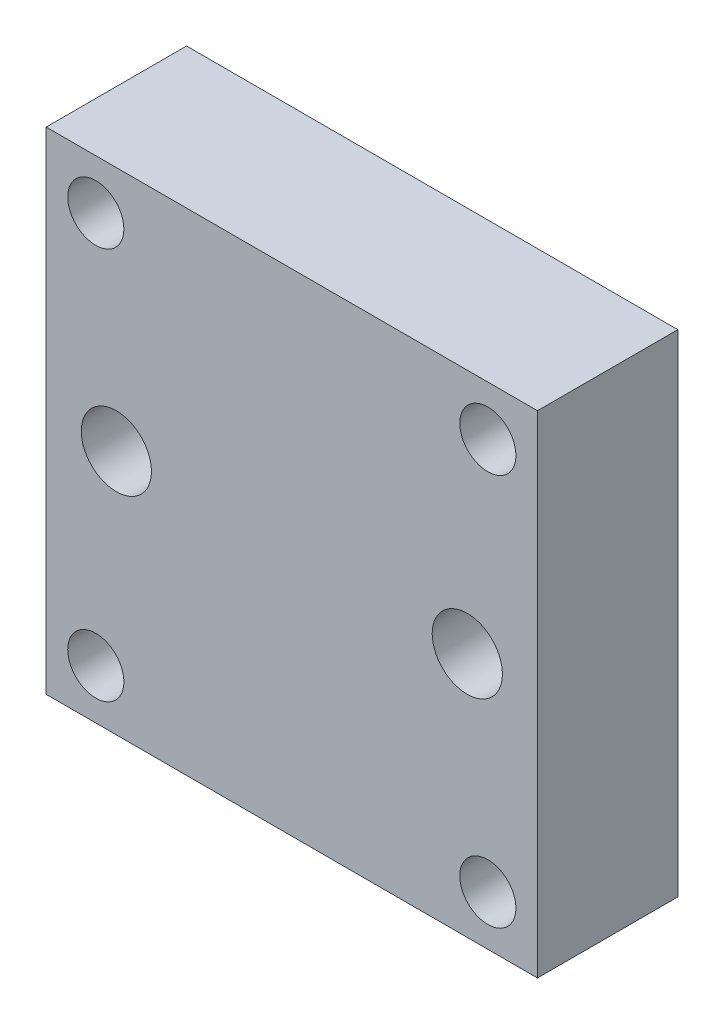
ISO-10303-21;
HEADER;
FILE_DESCRIPTION(('STEP AP214'),'2;1');
FILE_NAME('part.step','',(''),(''),'','','');
FILE_SCHEMA(('AUTOMOTIVE_DESIGN { 1 0 10303 214 1 1 1 1 }'));
ENDSEC;
DATA;
#1=APPLICATION_CONTEXT('core data for automotive mechanical design processes');
#2=APPLICATION_PROTOCOL_DEFINITION('international standard','automotive_design',2000,#1);
#3=PRODUCT_CONTEXT('',#1,'mechanical');
#4=PRODUCT('Part','Part','',(#3));
#5=PRODUCT_RELATED_PRODUCT_CATEGORY('part','',(#4));
#6=PRODUCT_DEFINITION_FORMATION('','',#4);
#7=PRODUCT_DEFINITION_CONTEXT('part definition',#1,'design');
#8=PRODUCT_DEFINITION('design','',#6,#7);
#9=PRODUCT_DEFINITION_SHAPE('','',#8);
#10=(LENGTH_UNIT() NAMED_UNIT(*) SI_UNIT(.MILLI.,.METRE.));
#11=(NAMED_UNIT(*) PLANE_ANGLE_UNIT() SI_UNIT($,.RADIAN.));
#12=(NAMED_UNIT(*) SI_UNIT($,.STERADIAN.) SOLID_ANGLE_UNIT());
#13=UNCERTAINTY_MEASURE_WITH_UNIT(LENGTH_MEASURE(1.E-05),#10,'distance_accuracy_value','');
#14=(GEOMETRIC_REPRESENTATION_CONTEXT(3) GLOBAL_UNCERTAINTY_ASSIGNED_CONTEXT((#13)) GLOBAL_UNIT_ASSIGNED_CONTEXT((#10,
#11,#12)) REPRESENTATION_CONTEXT('',''));
#15=CARTESIAN_POINT('',(0.,0.,0.));
#16=DIRECTION('',(0.,0.,1.));
#17=DIRECTION('',(1.,0.,0.));
#18=AXIS2_PLACEMENT_3D('',#15,#16,#17);
#19=CARTESIAN_POINT('',(0.,0.,10.));
#20=DIRECTION('',(0.,0.,1.));
#21=DIRECTION('',(1.,0.,0.));
#22=AXIS2_PLACEMENT_3D('',#19,#20,#21);
#23=PLANE('',#22);
#24=CARTESIAN_POINT('',(15.2777777777778,2.47027361373853,10.));
#25=DIRECTION('',(0.,0.,1.));
#26=DIRECTION('',(-1.,0.,0.));
#27=AXIS2_PLACEMENT_3D('',#24,#25,#26);
#28=CIRCLE('',#27,2.5);
#29=CARTESIAN_POINT('',(12.7777777777778,2.47027361373853,10.));
#30=VERTEX_POINT('',#29);
#31=EDGE_CURVE('E135',#30,#30,#28,.T.);
#32=ORIENTED_EDGE('',*,*,#31,.F.);
#33=EDGE_LOOP('',(#32));
#34=FACE_BOUND('',#33,.T.);
#35=CARTESIAN_POINT('',(-11.1866883162895,16.4347397078058,10.));
#36=DIRECTION('',(0.,0.,1.));
#37=DIRECTION('',(1.,0.,0.));
#38=AXIS2_PLACEMENT_3D('',#35,#36,#37);
#39=CIRCLE('',#38,2.);
#40=CARTESIAN_POINT('',(-9.18668831628949,16.4347397078058,10.));
#41=VERTEX_POINT('',#40);
#42=EDGE_CURVE('E123',#41,#41,#39,.T.);
#43=ORIENTED_EDGE('',*,*,#42,.F.);
#44=EDGE_LOOP('',(#43));
#45=FACE_BOUND('',#44,.T.);
#46=CARTESIAN_POINT('',(16.742243871845,-11.4941924803287,10.));
#47=DIRECTION('',(0.,0.,1.));
#48=DIRECTION('',(1.,0.,0.));
#49=AXIS2_PLACEMENT_3D('',#46,#47,#48);
#50=CIRCLE('',#49,2.);
#51=CARTESIAN_POINT('',(18.742243871845,-11.4941924803287,10.));
#52=VERTEX_POINT('',#51);
#53=EDGE_CURVE('E102',#52,#52,#50,.T.);
#54=ORIENTED_EDGE('',*,*,#53,.F.);
#55=EDGE_LOOP('',(#54));
#56=FACE_BOUND('',#55,.T.);
#57=DIRECTION('',(0.,-1.,0.));
#58=VECTOR('',#57,1.);
#59=CARTESIAN_POINT('',(-14.7222222222222,19.9702736137385,10.));
#60=LINE('',#59,#58);
#61=CARTESIAN_POINT('',(-14.7222222222222,19.9702736137385,10.));
#62=VERTEX_POINT('',#61);
#63=CARTESIAN_POINT('',(-14.7222222222222,-15.0297263862615,10.));
#64=VERTEX_POINT('',#63);
#65=EDGE_CURVE('E87',#62,#64,#60,.T.);
#66=ORIENTED_EDGE('',*,*,#65,.T.);
#67=DIRECTION('',(1.,0.,0.));
#68=VECTOR('',#67,1.);
#69=CARTESIAN_POINT('',(-14.7222222222222,-15.0297263862615,10.));
#70=LINE('',#69,#68);
#71=CARTESIAN_POINT('',(20.2777777777778,-15.0297263862615,10.));
#72=VERTEX_POINT('',#71);
#73=EDGE_CURVE('E82',#64,#72,#70,.T.);
#74=ORIENTED_EDGE('',*,*,#73,.T.);
#75=DIRECTION('',(0.,1.,0.));
#76=VECTOR('',#75,1.);
#77=CARTESIAN_POINT('',(20.2777777777778,19.9702736137385,10.));
#78=LINE('',#77,#76);
#79=CARTESIAN_POINT('',(20.2777777777778,19.9702736137385,10.));
#80=VERTEX_POINT('',#79);
#81=EDGE_CURVE('E85',#72,#80,#78,.T.);
#82=ORIENTED_EDGE('',*,*,#81,.T.);
#83=DIRECTION('',(-1.,0.,0.));
#84=VECTOR('',#83,1.);
#85=CARTESIAN_POINT('',(-14.7222222222222,19.9702736137385,10.));
#86=LINE('',#85,#84);
#87=EDGE_CURVE('E52',#80,#62,#86,.T.);
#88=ORIENTED_EDGE('',*,*,#87,.T.);
#89=EDGE_LOOP('',(#66,#74,#82,#88));
#90=FACE_BOUND('',#89,.T.);
#91=CARTESIAN_POINT('',(16.742243871845,16.4347397078058,10.));
#92=DIRECTION('',(0.,0.,1.));
#93=DIRECTION('',(-1.,0.,0.));
#94=AXIS2_PLACEMENT_3D('',#91,#92,#93);
#95=CIRCLE('',#94,2.);
#96=CARTESIAN_POINT('',(14.742243871845,16.4347397078058,10.));
#97=VERTEX_POINT('',#96);
#98=EDGE_CURVE('E117',#97,#97,#95,.T.);
#99=ORIENTED_EDGE('',*,*,#98,.F.);
#100=EDGE_LOOP('',(#99));
#101=FACE_BOUND('',#100,.T.);
#102=CARTESIAN_POINT('',(-11.1866883162895,-11.4941924803287,10.));
#103=DIRECTION('',(0.,0.,1.));
#104=DIRECTION('',(-1.,0.,0.));
#105=AXIS2_PLACEMENT_3D('',#102,#103,#104);
#106=CIRCLE('',#105,2.);
#107=CARTESIAN_POINT('',(-13.1866883162895,-11.4941924803287,10.));
#108=VERTEX_POINT('',#107);
#109=EDGE_CURVE('E129',#108,#108,#106,.T.);
#110=ORIENTED_EDGE('',*,*,#109,.F.);
#111=EDGE_LOOP('',(#110));
#112=FACE_BOUND('',#111,.T.);
#113=CARTESIAN_POINT('',(-9.72222222222222,2.47027361373853,10.));
#114=DIRECTION('',(0.,0.,1.));
#115=DIRECTION('',(1.,0.,0.));
#116=AXIS2_PLACEMENT_3D('',#113,#114,#115);
#117=CIRCLE('',#116,2.5);
#118=CARTESIAN_POINT('',(-7.22222222222222,2.47027361373853,10.));
#119=VERTEX_POINT('',#118);
#120=EDGE_CURVE('E141',#119,#119,#117,.T.);
#121=ORIENTED_EDGE('',*,*,#120,.F.);
#122=EDGE_LOOP('',(#121));
#123=FACE_BOUND('',#122,.T.);
#124=ADVANCED_FACE('F35',(#34,#45,#56,#90,#101,#112,#123),#23,.T.);
#125=CARTESIAN_POINT('',(0.,0.,0.));
#126=DIRECTION('',(0.,0.,1.));
#127=DIRECTION('',(1.,0.,0.));
#128=AXIS2_PLACEMENT_3D('',#125,#126,#127);
#129=PLANE('',#128);
#130=DIRECTION('',(0.,-1.,0.));
#131=VECTOR('',#130,1.);
#132=CARTESIAN_POINT('',(-14.7222222222222,19.9702736137385,0.));
#133=LINE('',#132,#131);
#134=CARTESIAN_POINT('',(-14.7222222222222,19.9702736137385,0.));
#135=VERTEX_POINT('',#134);
#136=CARTESIAN_POINT('',(-14.7222222222222,-15.0297263862615,0.));
#137=VERTEX_POINT('',#136);
#138=EDGE_CURVE('E99',#135,#137,#133,.T.);
#139=ORIENTED_EDGE('',*,*,#138,.F.);
#140=DIRECTION('',(-1.,0.,0.));
#141=VECTOR('',#140,1.);
#142=CARTESIAN_POINT('',(-14.7222222222222,19.9702736137385,0.));
#143=LINE('',#142,#141);
#144=CARTESIAN_POINT('',(20.2777777777778,19.9702736137385,0.));
#145=VERTEX_POINT('',#144);
#146=EDGE_CURVE('E75',#145,#135,#143,.T.);
#147=ORIENTED_EDGE('',*,*,#146,.F.);
#148=DIRECTION('',(0.,1.,0.));
#149=VECTOR('',#148,1.);
#150=CARTESIAN_POINT('',(20.2777777777778,19.9702736137385,0.));
#151=LINE('',#150,#149);
#152=CARTESIAN_POINT('',(20.2777777777778,-15.0297263862615,0.));
#153=VERTEX_POINT('',#152);
#154=EDGE_CURVE('E69',#153,#145,#151,.T.);
#155=ORIENTED_EDGE('',*,*,#154,.F.);
#156=DIRECTION('',(1.,0.,0.));
#157=VECTOR('',#156,1.);
#158=CARTESIAN_POINT('',(-14.7222222222222,-15.0297263862615,0.));
#159=LINE('',#158,#157);
#160=EDGE_CURVE('E91',#137,#153,#159,.T.);
#161=ORIENTED_EDGE('',*,*,#160,.F.);
#162=EDGE_LOOP('',(#139,#147,#155,#161));
#163=FACE_BOUND('',#162,.T.);
#164=CARTESIAN_POINT('',(16.742243871845,-11.4941924803287,0.));
#165=DIRECTION('',(0.,0.,1.));
#166=DIRECTION('',(1.,0.,0.));
#167=AXIS2_PLACEMENT_3D('',#164,#165,#166);
#168=CIRCLE('',#167,2.);
#169=CARTESIAN_POINT('',(18.742243871845,-11.4941924803287,0.));
#170=VERTEX_POINT('',#169);
#171=EDGE_CURVE('E114',#170,#170,#168,.T.);
#172=ORIENTED_EDGE('',*,*,#171,.T.);
#173=EDGE_LOOP('',(#172));
#174=FACE_BOUND('',#173,.T.);
#175=CARTESIAN_POINT('',(16.742243871845,16.4347397078058,0.));
#176=DIRECTION('',(0.,0.,1.));
#177=DIRECTION('',(-1.,0.,0.));
#178=AXIS2_PLACEMENT_3D('',#175,#176,#177);
#179=CIRCLE('',#178,2.);
#180=CARTESIAN_POINT('',(14.742243871845,16.4347397078058,0.));
#181=VERTEX_POINT('',#180);
#182=EDGE_CURVE('E120',#181,#181,#179,.T.);
#183=ORIENTED_EDGE('',*,*,#182,.T.);
#184=EDGE_LOOP('',(#183));
#185=FACE_BOUND('',#184,.T.);
#186=CARTESIAN_POINT('',(-11.1866883162895,16.4347397078058,0.));
#187=DIRECTION('',(0.,0.,1.));
#188=DIRECTION('',(1.,0.,0.));
#189=AXIS2_PLACEMENT_3D('',#186,#187,#188);
#190=CIRCLE('',#189,2.);
#191=CARTESIAN_POINT('',(-9.18668831628949,16.4347397078058,0.));
#192=VERTEX_POINT('',#191);
#193=EDGE_CURVE('E126',#192,#192,#190,.T.);
#194=ORIENTED_EDGE('',*,*,#193,.T.);
#195=EDGE_LOOP('',(#194));
#196=FACE_BOUND('',#195,.T.);
#197=CARTESIAN_POINT('',(-11.1866883162895,-11.4941924803287,0.));
#198=DIRECTION('',(0.,0.,1.));
#199=DIRECTION('',(-1.,0.,0.));
#200=AXIS2_PLACEMENT_3D('',#197,#198,#199);
#201=CIRCLE('',#200,2.);
#202=CARTESIAN_POINT('',(-13.1866883162895,-11.4941924803287,0.));
#203=VERTEX_POINT('',#202);
#204=EDGE_CURVE('E132',#203,#203,#201,.T.);
#205=ORIENTED_EDGE('',*,*,#204,.T.);
#206=EDGE_LOOP('',(#205));
#207=FACE_BOUND('',#206,.T.);
#208=CARTESIAN_POINT('',(15.2777777777778,2.47027361373853,0.));
#209=DIRECTION('',(0.,0.,1.));
#210=DIRECTION('',(-1.,0.,0.));
#211=AXIS2_PLACEMENT_3D('',#208,#209,#210);
#212=CIRCLE('',#211,2.5);
#213=CARTESIAN_POINT('',(12.7777777777778,2.47027361373853,0.));
#214=VERTEX_POINT('',#213);
#215=EDGE_CURVE('E138',#214,#214,#212,.T.);
#216=ORIENTED_EDGE('',*,*,#215,.T.);
#217=EDGE_LOOP('',(#216));
#218=FACE_BOUND('',#217,.T.);
#219=CARTESIAN_POINT('',(-9.72222222222222,2.47027361373853,0.));
#220=DIRECTION('',(0.,0.,1.));
#221=DIRECTION('',(1.,0.,0.));
#222=AXIS2_PLACEMENT_3D('',#219,#220,#221);
#223=CIRCLE('',#222,2.5);
#224=CARTESIAN_POINT('',(-7.22222222222222,2.47027361373853,0.));
#225=VERTEX_POINT('',#224);
#226=EDGE_CURVE('E144',#225,#225,#223,.T.);
#227=ORIENTED_EDGE('',*,*,#226,.T.);
#228=EDGE_LOOP('',(#227));
#229=FACE_BOUND('',#228,.T.);
#230=ADVANCED_FACE('F110',(#163,#174,#185,#196,#207,#218,#229),#129,.F.);
#231=CARTESIAN_POINT('',(-14.7222222222222,19.9702736137385,10.));
#232=DIRECTION('',(1.,0.,0.));
#233=DIRECTION('',(0.,1.,0.));
#234=AXIS2_PLACEMENT_3D('',#231,#232,#233);
#235=PLANE('',#234);
#236=ORIENTED_EDGE('',*,*,#138,.T.);
#237=DIRECTION('',(0.,0.,-1.));
#238=VECTOR('',#237,1.);
#239=CARTESIAN_POINT('',(-14.7222222222222,-15.0297263862615,10.));
#240=LINE('',#239,#238);
#241=EDGE_CURVE('E11',#64,#137,#240,.T.);
#242=ORIENTED_EDGE('',*,*,#241,.F.);
#243=ORIENTED_EDGE('',*,*,#65,.F.);
#244=DIRECTION('',(0.,0.,-1.));
#245=VECTOR('',#244,1.);
#246=CARTESIAN_POINT('',(-14.7222222222222,19.9702736137385,10.));
#247=LINE('',#246,#245);
#248=EDGE_CURVE('E95',#62,#135,#247,.T.);
#249=ORIENTED_EDGE('',*,*,#248,.T.);
#250=EDGE_LOOP('',(#236,#242,#243,#249));
#251=FACE_BOUND('',#250,.T.);
#252=ADVANCED_FACE('F37',(#251),#235,.F.);
#253=CARTESIAN_POINT('',(-14.7222222222222,-15.0297263862615,10.));
#254=DIRECTION('',(0.,1.,0.));
#255=DIRECTION('',(-1.,0.,0.));
#256=AXIS2_PLACEMENT_3D('',#253,#254,#255);
#257=PLANE('',#256);
#258=ORIENTED_EDGE('',*,*,#160,.T.);
#259=DIRECTION('',(0.,0.,-1.));
#260=VECTOR('',#259,1.);
#261=CARTESIAN_POINT('',(20.2777777777778,-15.0297263862615,10.));
#262=LINE('',#261,#260);
#263=EDGE_CURVE('E44',#72,#153,#262,.T.);
#264=ORIENTED_EDGE('',*,*,#263,.F.);
#265=ORIENTED_EDGE('',*,*,#73,.F.);
#266=ORIENTED_EDGE('',*,*,#241,.T.);
#267=EDGE_LOOP('',(#258,#264,#265,#266));
#268=FACE_BOUND('',#267,.T.);
#269=ADVANCED_FACE('F90',(#268),#257,.F.);
#270=CARTESIAN_POINT('',(20.2777777777778,19.9702736137385,10.));
#271=DIRECTION('',(-1.,0.,0.));
#272=DIRECTION('',(0.,0.,1.));
#273=AXIS2_PLACEMENT_3D('',#270,#271,#272);
#274=PLANE('',#273);
#275=ORIENTED_EDGE('',*,*,#154,.T.);
#276=DIRECTION('',(0.,0.,-1.));
#277=VECTOR('',#276,1.);
#278=CARTESIAN_POINT('',(20.2777777777778,19.9702736137385,10.));
#279=LINE('',#278,#277);
#280=EDGE_CURVE('E92',#80,#145,#279,.T.);
#281=ORIENTED_EDGE('',*,*,#280,.F.);
#282=ORIENTED_EDGE('',*,*,#81,.F.);
#283=ORIENTED_EDGE('',*,*,#263,.T.);
#284=EDGE_LOOP('',(#275,#281,#282,#283));
#285=FACE_BOUND('',#284,.T.);
#286=ADVANCED_FACE('F93',(#285),#274,.F.);
#287=CARTESIAN_POINT('',(-14.7222222222222,19.9702736137385,10.));
#288=DIRECTION('',(0.,-1.,0.));
#289=DIRECTION('',(0.,0.,-1.));
#290=AXIS2_PLACEMENT_3D('',#287,#288,#289);
#291=PLANE('',#290);
#292=ORIENTED_EDGE('',*,*,#146,.T.);
#293=ORIENTED_EDGE('',*,*,#248,.F.);
#294=ORIENTED_EDGE('',*,*,#87,.F.);
#295=ORIENTED_EDGE('',*,*,#280,.T.);
#296=EDGE_LOOP('',(#292,#293,#294,#295));
#297=FACE_BOUND('',#296,.T.);
#298=ADVANCED_FACE('F107',(#297),#291,.F.);
#299=CARTESIAN_POINT('',(16.742243871845,-11.4941924803287,10.));
#300=DIRECTION('',(0.,0.,-1.));
#301=DIRECTION('',(-1.,0.,0.));
#302=AXIS2_PLACEMENT_3D('',#299,#300,#301);
#303=CYLINDRICAL_SURFACE('',#302,2.);
#304=ORIENTED_EDGE('',*,*,#53,.T.);
#305=EDGE_LOOP('',(#304));
#306=FACE_BOUND('',#305,.T.);
#307=ORIENTED_EDGE('',*,*,#171,.F.);
#308=EDGE_LOOP('',(#307));
#309=FACE_BOUND('',#308,.T.);
#310=ADVANCED_FACE('F163',(#306,#309),#303,.F.);
#311=CARTESIAN_POINT('',(16.742243871845,16.4347397078058,10.));
#312=DIRECTION('',(0.,0.,-1.));
#313=DIRECTION('',(-1.,0.,0.));
#314=AXIS2_PLACEMENT_3D('',#311,#312,#313);
#315=CYLINDRICAL_SURFACE('',#314,2.);
#316=ORIENTED_EDGE('',*,*,#98,.T.);
#317=EDGE_LOOP('',(#316));
#318=FACE_BOUND('',#317,.T.);
#319=ORIENTED_EDGE('',*,*,#182,.F.);
#320=EDGE_LOOP('',(#319));
#321=FACE_BOUND('',#320,.T.);
#322=ADVANCED_FACE('F209',(#318,#321),#315,.F.);
#323=CARTESIAN_POINT('',(-11.1866883162895,16.4347397078058,10.));
#324=DIRECTION('',(0.,0.,-1.));
#325=DIRECTION('',(-1.,0.,0.));
#326=AXIS2_PLACEMENT_3D('',#323,#324,#325);
#327=CYLINDRICAL_SURFACE('',#326,2.);
#328=ORIENTED_EDGE('',*,*,#42,.T.);
#329=EDGE_LOOP('',(#328));
#330=FACE_BOUND('',#329,.T.);
#331=ORIENTED_EDGE('',*,*,#193,.F.);
#332=EDGE_LOOP('',(#331));
#333=FACE_BOUND('',#332,.T.);
#334=ADVANCED_FACE('F217',(#330,#333),#327,.F.);
#335=CARTESIAN_POINT('',(-11.1866883162895,-11.4941924803287,10.));
#336=DIRECTION('',(0.,0.,-1.));
#337=DIRECTION('',(-1.,0.,0.));
#338=AXIS2_PLACEMENT_3D('',#335,#336,#337);
#339=CYLINDRICAL_SURFACE('',#338,2.);
#340=ORIENTED_EDGE('',*,*,#109,.T.);
#341=EDGE_LOOP('',(#340));
#342=FACE_BOUND('',#341,.T.);
#343=ORIENTED_EDGE('',*,*,#204,.F.);
#344=EDGE_LOOP('',(#343));
#345=FACE_BOUND('',#344,.T.);
#346=ADVANCED_FACE('F225',(#342,#345),#339,.F.);
#347=CARTESIAN_POINT('',(15.2777777777778,2.47027361373853,10.));
#348=DIRECTION('',(0.,0.,-1.));
#349=DIRECTION('',(-1.,0.,0.));
#350=AXIS2_PLACEMENT_3D('',#347,#348,#349);
#351=CYLINDRICAL_SURFACE('',#350,2.5);
#352=ORIENTED_EDGE('',*,*,#31,.T.);
#353=EDGE_LOOP('',(#352));
#354=FACE_BOUND('',#353,.T.);
#355=ORIENTED_EDGE('',*,*,#215,.F.);
#356=EDGE_LOOP('',(#355));
#357=FACE_BOUND('',#356,.T.);
#358=ADVANCED_FACE('F234',(#354,#357),#351,.F.);
#359=CARTESIAN_POINT('',(-9.72222222222222,2.47027361373853,10.));
#360=DIRECTION('',(0.,0.,-1.));
#361=DIRECTION('',(-1.,0.,0.));
#362=AXIS2_PLACEMENT_3D('',#359,#360,#361);
#363=CYLINDRICAL_SURFACE('',#362,2.5);
#364=ORIENTED_EDGE('',*,*,#120,.T.);
#365=EDGE_LOOP('',(#364));
#366=FACE_BOUND('',#365,.T.);
#367=ORIENTED_EDGE('',*,*,#226,.F.);
#368=EDGE_LOOP('',(#367));
#369=FACE_BOUND('',#368,.T.);
#370=ADVANCED_FACE('F150',(#366,#369),#363,.F.);
#371=CLOSED_SHELL('',(#124,#230,#252,#269,#286,#298,#310,#322,#334,#346,#358,#370));
#372=MANIFOLD_SOLID_BREP('B2',#371);
#373=ADVANCED_BREP_SHAPE_REPRESENTATION('',(#18,#372),#14);
#374=SHAPE_DEFINITION_REPRESENTATION(#9,#373);
ENDSEC;
END-ISO-10303-21;
